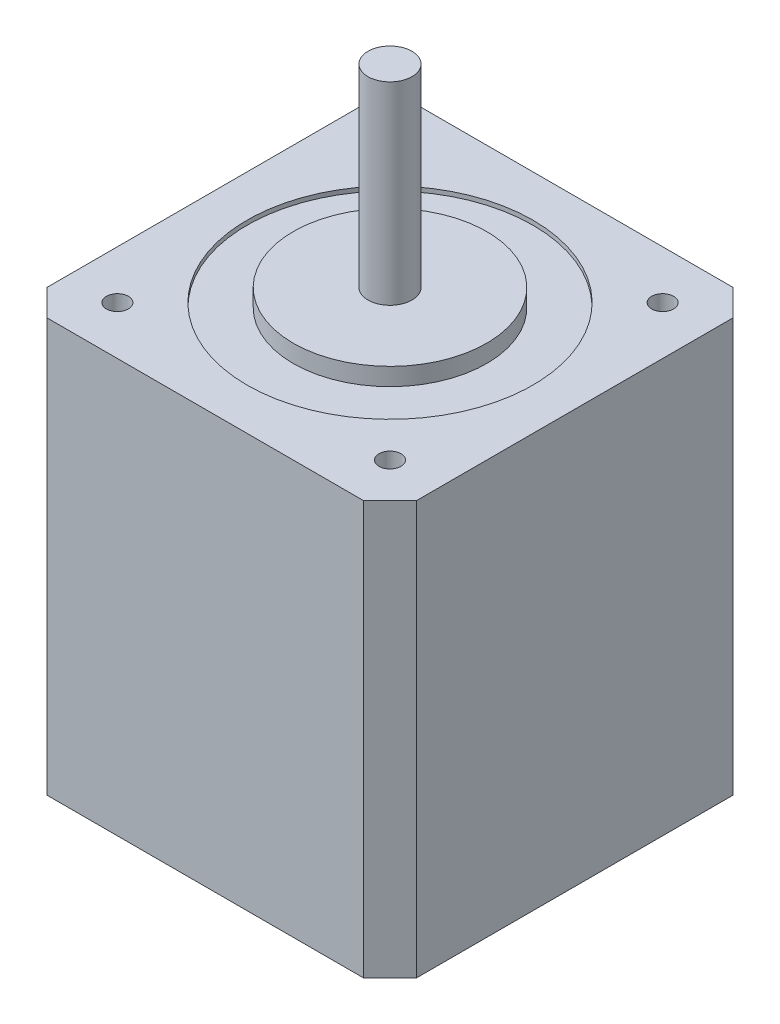
ISO-10303-21;
HEADER;
FILE_DESCRIPTION(('STEP AP214'),'2;1');
FILE_NAME('part.step','',(''),(''),'','','');
FILE_SCHEMA(('AUTOMOTIVE_DESIGN { 1 0 10303 214 1 1 1 1 }'));
ENDSEC;
DATA;
#1=APPLICATION_CONTEXT('core data for automotive mechanical design processes');
#2=APPLICATION_PROTOCOL_DEFINITION('international standard','automotive_design',2000,#1);
#3=PRODUCT_CONTEXT('',#1,'mechanical');
#4=PRODUCT('Part','Part','',(#3));
#5=PRODUCT_RELATED_PRODUCT_CATEGORY('part','',(#4));
#6=PRODUCT_DEFINITION_FORMATION('','',#4);
#7=PRODUCT_DEFINITION_CONTEXT('part definition',#1,'design');
#8=PRODUCT_DEFINITION('design','',#6,#7);
#9=PRODUCT_DEFINITION_SHAPE('','',#8);
#10=(LENGTH_UNIT() NAMED_UNIT(*) SI_UNIT(.MILLI.,.METRE.));
#11=(NAMED_UNIT(*) PLANE_ANGLE_UNIT() SI_UNIT($,.RADIAN.));
#12=(NAMED_UNIT(*) SI_UNIT($,.STERADIAN.) SOLID_ANGLE_UNIT());
#13=UNCERTAINTY_MEASURE_WITH_UNIT(LENGTH_MEASURE(1.E-05),#10,'distance_accuracy_value','');
#14=(GEOMETRIC_REPRESENTATION_CONTEXT(3) GLOBAL_UNCERTAINTY_ASSIGNED_CONTEXT((#13)) GLOBAL_UNIT_ASSIGNED_CONTEXT((#10,
#11,#12)) REPRESENTATION_CONTEXT('',''));
#15=CARTESIAN_POINT('',(0.,0.,0.));
#16=DIRECTION('',(0.,0.,1.));
#17=DIRECTION('',(1.,0.,0.));
#18=AXIS2_PLACEMENT_3D('',#15,#16,#17);
#19=CARTESIAN_POINT('',(21.,47.,21.));
#20=DIRECTION('',(-1.,0.,0.));
#21=DIRECTION('',(0.,0.,1.));
#22=AXIS2_PLACEMENT_3D('',#19,#20,#21);
#23=PLANE('',#22);
#24=DIRECTION('',(0.,0.,-1.));
#25=VECTOR('',#24,1.);
#26=CARTESIAN_POINT('',(21.,47.,21.));
#27=LINE('',#26,#25);
#28=CARTESIAN_POINT('',(21.,47.,18.));
#29=VERTEX_POINT('',#28);
#30=CARTESIAN_POINT('',(21.,47.,-18.));
#31=VERTEX_POINT('',#30);
#32=EDGE_CURVE('E161',#29,#31,#27,.T.);
#33=ORIENTED_EDGE('',*,*,#32,.F.);
#34=DIRECTION('',(0.,-1.,0.));
#35=VECTOR('',#34,1.);
#36=CARTESIAN_POINT('',(21.,47.,18.));
#37=LINE('',#36,#35);
#38=CARTESIAN_POINT('',(21.,0.,18.));
#39=VERTEX_POINT('',#38);
#40=EDGE_CURVE('E208',#29,#39,#37,.T.);
#41=ORIENTED_EDGE('',*,*,#40,.T.);
#42=DIRECTION('',(0.,0.,-1.));
#43=VECTOR('',#42,1.);
#44=CARTESIAN_POINT('',(21.,0.,21.));
#45=LINE('',#44,#43);
#46=CARTESIAN_POINT('',(21.,0.,-18.));
#47=VERTEX_POINT('',#46);
#48=EDGE_CURVE('E158',#39,#47,#45,.T.);
#49=ORIENTED_EDGE('',*,*,#48,.T.);
#50=DIRECTION('',(0.,1.,0.));
#51=VECTOR('',#50,1.);
#52=CARTESIAN_POINT('',(21.,47.,-18.));
#53=LINE('',#52,#51);
#54=EDGE_CURVE('E206',#47,#31,#53,.T.);
#55=ORIENTED_EDGE('',*,*,#54,.T.);
#56=EDGE_LOOP('',(#33,#41,#49,#55));
#57=FACE_BOUND('',#56,.T.);
#58=ADVANCED_FACE('F34',(#57),#23,.F.);
#59=CARTESIAN_POINT('',(-21.,47.,-21.));
#60=DIRECTION('',(0.,0.,1.));
#61=DIRECTION('',(1.,0.,0.));
#62=AXIS2_PLACEMENT_3D('',#59,#60,#61);
#63=PLANE('',#62);
#64=DIRECTION('',(-1.,0.,0.));
#65=VECTOR('',#64,1.);
#66=CARTESIAN_POINT('',(-21.,0.,-21.));
#67=LINE('',#66,#65);
#68=CARTESIAN_POINT('',(18.,0.,-21.));
#69=VERTEX_POINT('',#68);
#70=CARTESIAN_POINT('',(-18.,0.,-21.));
#71=VERTEX_POINT('',#70);
#72=EDGE_CURVE('E175',#69,#71,#67,.T.);
#73=ORIENTED_EDGE('',*,*,#72,.T.);
#74=DIRECTION('',(0.,1.,0.));
#75=VECTOR('',#74,1.);
#76=CARTESIAN_POINT('',(-18.,47.,-21.));
#77=LINE('',#76,#75);
#78=CARTESIAN_POINT('',(-18.,47.,-21.));
#79=VERTEX_POINT('',#78);
#80=EDGE_CURVE('E11',#71,#79,#77,.T.);
#81=ORIENTED_EDGE('',*,*,#80,.T.);
#82=DIRECTION('',(-1.,0.,0.));
#83=VECTOR('',#82,1.);
#84=CARTESIAN_POINT('',(-21.,47.,-21.));
#85=LINE('',#84,#83);
#86=CARTESIAN_POINT('',(18.,47.,-21.));
#87=VERTEX_POINT('',#86);
#88=EDGE_CURVE('E163',#87,#79,#85,.T.);
#89=ORIENTED_EDGE('',*,*,#88,.F.);
#90=DIRECTION('',(0.,-1.,0.));
#91=VECTOR('',#90,1.);
#92=CARTESIAN_POINT('',(18.,47.,-21.));
#93=LINE('',#92,#91);
#94=EDGE_CURVE('E42',#87,#69,#93,.T.);
#95=ORIENTED_EDGE('',*,*,#94,.T.);
#96=EDGE_LOOP('',(#73,#81,#89,#95));
#97=FACE_BOUND('',#96,.T.);
#98=ADVANCED_FACE('F213',(#97),#63,.F.);
#99=CARTESIAN_POINT('',(-21.,47.,21.));
#100=DIRECTION('',(1.,0.,0.));
#101=DIRECTION('',(0.,0.,-1.));
#102=AXIS2_PLACEMENT_3D('',#99,#100,#101);
#103=PLANE('',#102);
#104=DIRECTION('',(0.,0.,1.));
#105=VECTOR('',#104,1.);
#106=CARTESIAN_POINT('',(-21.,0.,21.));
#107=LINE('',#106,#105);
#108=CARTESIAN_POINT('',(-21.,0.,-18.));
#109=VERTEX_POINT('',#108);
#110=CARTESIAN_POINT('',(-21.,0.,18.));
#111=VERTEX_POINT('',#110);
#112=EDGE_CURVE('E177',#109,#111,#107,.T.);
#113=ORIENTED_EDGE('',*,*,#112,.T.);
#114=DIRECTION('',(0.,1.,0.));
#115=VECTOR('',#114,1.);
#116=CARTESIAN_POINT('',(-21.,47.,18.));
#117=LINE('',#116,#115);
#118=CARTESIAN_POINT('',(-21.,47.,18.));
#119=VERTEX_POINT('',#118);
#120=EDGE_CURVE('E197',#111,#119,#117,.T.);
#121=ORIENTED_EDGE('',*,*,#120,.T.);
#122=DIRECTION('',(0.,0.,1.));
#123=VECTOR('',#122,1.);
#124=CARTESIAN_POINT('',(-21.,47.,21.));
#125=LINE('',#124,#123);
#126=CARTESIAN_POINT('',(-21.,47.,-18.));
#127=VERTEX_POINT('',#126);
#128=EDGE_CURVE('E166',#127,#119,#125,.T.);
#129=ORIENTED_EDGE('',*,*,#128,.F.);
#130=DIRECTION('',(0.,-1.,0.));
#131=VECTOR('',#130,1.);
#132=CARTESIAN_POINT('',(-21.,47.,-18.));
#133=LINE('',#132,#131);
#134=EDGE_CURVE('E194',#127,#109,#133,.T.);
#135=ORIENTED_EDGE('',*,*,#134,.T.);
#136=EDGE_LOOP('',(#113,#121,#129,#135));
#137=FACE_BOUND('',#136,.T.);
#138=ADVANCED_FACE('F226',(#137),#103,.F.);
#139=CARTESIAN_POINT('',(-21.,47.,21.));
#140=DIRECTION('',(0.,0.,-1.));
#141=DIRECTION('',(-1.,0.,0.));
#142=AXIS2_PLACEMENT_3D('',#139,#140,#141);
#143=PLANE('',#142);
#144=DIRECTION('',(1.,0.,0.));
#145=VECTOR('',#144,1.);
#146=CARTESIAN_POINT('',(-21.,47.,21.));
#147=LINE('',#146,#145);
#148=CARTESIAN_POINT('',(-18.,47.,21.));
#149=VERTEX_POINT('',#148);
#150=CARTESIAN_POINT('',(18.,47.,21.));
#151=VERTEX_POINT('',#150);
#152=EDGE_CURVE('E169',#149,#151,#147,.T.);
#153=ORIENTED_EDGE('',*,*,#152,.F.);
#154=DIRECTION('',(0.,-1.,0.));
#155=VECTOR('',#154,1.);
#156=CARTESIAN_POINT('',(-18.,47.,21.));
#157=LINE('',#156,#155);
#158=CARTESIAN_POINT('',(-18.,0.,21.));
#159=VERTEX_POINT('',#158);
#160=EDGE_CURVE('E183',#149,#159,#157,.T.);
#161=ORIENTED_EDGE('',*,*,#160,.T.);
#162=DIRECTION('',(1.,0.,0.));
#163=VECTOR('',#162,1.);
#164=CARTESIAN_POINT('',(-21.,0.,21.));
#165=LINE('',#164,#163);
#166=CARTESIAN_POINT('',(18.,0.,21.));
#167=VERTEX_POINT('',#166);
#168=EDGE_CURVE('E164',#159,#167,#165,.T.);
#169=ORIENTED_EDGE('',*,*,#168,.T.);
#170=DIRECTION('',(0.,1.,0.));
#171=VECTOR('',#170,1.);
#172=CARTESIAN_POINT('',(18.,47.,21.));
#173=LINE('',#172,#171);
#174=EDGE_CURVE('E172',#167,#151,#173,.T.);
#175=ORIENTED_EDGE('',*,*,#174,.T.);
#176=EDGE_LOOP('',(#153,#161,#169,#175));
#177=FACE_BOUND('',#176,.T.);
#178=ADVANCED_FACE('F235',(#177),#143,.F.);
#179=CARTESIAN_POINT('',(0.,47.,0.));
#180=DIRECTION('',(0.,-1.,0.));
#181=DIRECTION('',(0.,0.,-1.));
#182=AXIS2_PLACEMENT_3D('',#179,#180,#181);
#183=PLANE('',#182);
#184=CARTESIAN_POINT('',(-15.5,47.,-15.5));
#185=DIRECTION('',(0.,1.,0.));
#186=DIRECTION('',(0.,0.,1.));
#187=AXIS2_PLACEMENT_3D('',#184,#185,#186);
#188=CIRCLE('',#187,1.24999999999999);
#189=CARTESIAN_POINT('',(-15.5,47.,-14.25));
#190=VERTEX_POINT('',#189);
#191=EDGE_CURVE('E120',#190,#190,#188,.T.);
#192=ORIENTED_EDGE('',*,*,#191,.F.);
#193=EDGE_LOOP('',(#192));
#194=FACE_BOUND('',#193,.T.);
#195=CARTESIAN_POINT('',(-15.5,47.,15.5));
#196=DIRECTION('',(0.,1.,0.));
#197=DIRECTION('',(0.,0.,1.));
#198=AXIS2_PLACEMENT_3D('',#195,#196,#197);
#199=CIRCLE('',#198,1.24999999999999);
#200=CARTESIAN_POINT('',(-15.5,47.,16.75));
#201=VERTEX_POINT('',#200);
#202=EDGE_CURVE('E119',#201,#201,#199,.T.);
#203=ORIENTED_EDGE('',*,*,#202,.F.);
#204=EDGE_LOOP('',(#203));
#205=FACE_BOUND('',#204,.T.);
#206=CARTESIAN_POINT('',(15.5,47.,-15.5));
#207=DIRECTION('',(0.,1.,0.));
#208=DIRECTION('',(0.,0.,1.));
#209=AXIS2_PLACEMENT_3D('',#206,#207,#208);
#210=CIRCLE('',#209,1.24999999999999);
#211=CARTESIAN_POINT('',(15.5,47.,-14.25));
#212=VERTEX_POINT('',#211);
#213=EDGE_CURVE('E130',#212,#212,#210,.T.);
#214=ORIENTED_EDGE('',*,*,#213,.F.);
#215=EDGE_LOOP('',(#214));
#216=FACE_BOUND('',#215,.T.);
#217=CARTESIAN_POINT('',(15.5,47.,15.5));
#218=DIRECTION('',(0.,1.,0.));
#219=DIRECTION('',(0.,0.,1.));
#220=AXIS2_PLACEMENT_3D('',#217,#218,#219);
#221=CIRCLE('',#220,1.24999999999999);
#222=CARTESIAN_POINT('',(15.5,47.,16.75));
#223=VERTEX_POINT('',#222);
#224=EDGE_CURVE('E136',#223,#223,#221,.T.);
#225=ORIENTED_EDGE('',*,*,#224,.F.);
#226=EDGE_LOOP('',(#225));
#227=FACE_BOUND('',#226,.T.);
#228=CARTESIAN_POINT('',(0.,47.,0.));
#229=DIRECTION('',(0.,1.,0.));
#230=DIRECTION('',(0.,0.,1.));
#231=AXIS2_PLACEMENT_3D('',#228,#229,#230);
#232=CIRCLE('',#231,16.25);
#233=CARTESIAN_POINT('',(0.,47.,16.25));
#234=VERTEX_POINT('',#233);
#235=EDGE_CURVE('E152',#234,#234,#232,.T.);
#236=ORIENTED_EDGE('',*,*,#235,.F.);
#237=EDGE_LOOP('',(#236));
#238=FACE_BOUND('',#237,.T.);
#239=ORIENTED_EDGE('',*,*,#128,.T.);
#240=DIRECTION('',(-0.707106781186546,0.,-0.707106781186549));
#241=VECTOR('',#240,1.);
#242=CARTESIAN_POINT('',(-18.,47.,21.));
#243=LINE('',#242,#241);
#244=EDGE_CURVE('E204',#119,#149,#243,.F.);
#245=ORIENTED_EDGE('',*,*,#244,.T.);
#246=ORIENTED_EDGE('',*,*,#152,.T.);
#247=DIRECTION('',(-0.707106781186549,0.,0.707106781186546));
#248=VECTOR('',#247,1.);
#249=CARTESIAN_POINT('',(21.,47.,18.));
#250=LINE('',#249,#248);
#251=EDGE_CURVE('E202',#151,#29,#250,.F.);
#252=ORIENTED_EDGE('',*,*,#251,.T.);
#253=ORIENTED_EDGE('',*,*,#32,.T.);
#254=DIRECTION('',(0.707106781186546,0.,0.707106781186549));
#255=VECTOR('',#254,1.);
#256=CARTESIAN_POINT('',(18.,47.,-21.));
#257=LINE('',#256,#255);
#258=EDGE_CURVE('E54',#31,#87,#257,.F.);
#259=ORIENTED_EDGE('',*,*,#258,.T.);
#260=ORIENTED_EDGE('',*,*,#88,.T.);
#261=DIRECTION('',(0.707106781186549,0.,-0.707106781186546));
#262=VECTOR('',#261,1.);
#263=CARTESIAN_POINT('',(-21.,47.,-18.));
#264=LINE('',#263,#262);
#265=EDGE_CURVE('E200',#79,#127,#264,.F.);
#266=ORIENTED_EDGE('',*,*,#265,.T.);
#267=EDGE_LOOP('',(#239,#245,#246,#252,#253,#259,#260,#266));
#268=FACE_BOUND('',#267,.T.);
#269=ADVANCED_FACE('F229',(#194,#205,#216,#227,#238,#268),#183,.F.);
#270=CARTESIAN_POINT('',(0.,0.,0.));
#271=DIRECTION('',(0.,-1.,0.));
#272=DIRECTION('',(0.,0.,-1.));
#273=AXIS2_PLACEMENT_3D('',#270,#271,#272);
#274=PLANE('',#273);
#275=ORIENTED_EDGE('',*,*,#168,.F.);
#276=DIRECTION('',(0.707106781186546,0.,0.707106781186549));
#277=VECTOR('',#276,1.);
#278=CARTESIAN_POINT('',(-19.5,0.,19.4999999999999));
#279=LINE('',#278,#277);
#280=EDGE_CURVE('E192',#159,#111,#279,.F.);
#281=ORIENTED_EDGE('',*,*,#280,.T.);
#282=ORIENTED_EDGE('',*,*,#112,.F.);
#283=DIRECTION('',(-0.707106781186549,0.,0.707106781186546));
#284=VECTOR('',#283,1.);
#285=CARTESIAN_POINT('',(-19.4999999999999,0.,-19.5));
#286=LINE('',#285,#284);
#287=EDGE_CURVE('E188',#109,#71,#286,.F.);
#288=ORIENTED_EDGE('',*,*,#287,.T.);
#289=ORIENTED_EDGE('',*,*,#72,.F.);
#290=DIRECTION('',(-0.707106781186546,0.,-0.707106781186549));
#291=VECTOR('',#290,1.);
#292=CARTESIAN_POINT('',(19.5,0.,-19.4999999999999));
#293=LINE('',#292,#291);
#294=EDGE_CURVE('E186',#69,#47,#293,.F.);
#295=ORIENTED_EDGE('',*,*,#294,.T.);
#296=ORIENTED_EDGE('',*,*,#48,.F.);
#297=DIRECTION('',(0.707106781186549,0.,-0.707106781186546));
#298=VECTOR('',#297,1.);
#299=CARTESIAN_POINT('',(19.4999999999999,0.,19.5));
#300=LINE('',#299,#298);
#301=EDGE_CURVE('E190',#39,#167,#300,.F.);
#302=ORIENTED_EDGE('',*,*,#301,.T.);
#303=EDGE_LOOP('',(#275,#281,#282,#288,#289,#295,#296,#302));
#304=FACE_BOUND('',#303,.T.);
#305=ADVANCED_FACE('F217',(#304),#274,.T.);
#306=CARTESIAN_POINT('',(0.,46.5,0.));
#307=DIRECTION('',(0.,1.,0.));
#308=DIRECTION('',(0.,0.,1.));
#309=AXIS2_PLACEMENT_3D('',#306,#307,#308);
#310=CYLINDRICAL_SURFACE('',#309,16.25);
#311=CARTESIAN_POINT('',(0.,46.5,0.));
#312=DIRECTION('',(0.,1.,0.));
#313=DIRECTION('',(0.,0.,1.));
#314=AXIS2_PLACEMENT_3D('',#311,#312,#313);
#315=CIRCLE('',#314,16.25);
#316=CARTESIAN_POINT('',(0.,46.5,16.25));
#317=VERTEX_POINT('',#316);
#318=EDGE_CURVE('E155',#317,#317,#315,.T.);
#319=ORIENTED_EDGE('',*,*,#318,.F.);
#320=EDGE_LOOP('',(#319));
#321=FACE_BOUND('',#320,.T.);
#322=ORIENTED_EDGE('',*,*,#235,.T.);
#323=EDGE_LOOP('',(#322));
#324=FACE_BOUND('',#323,.T.);
#325=ADVANCED_FACE('F375',(#321,#324),#310,.F.);
#326=CARTESIAN_POINT('',(0.,46.5,0.));
#327=DIRECTION('',(0.,1.,0.));
#328=DIRECTION('',(0.,0.,1.));
#329=AXIS2_PLACEMENT_3D('',#326,#327,#328);
#330=PLANE('',#329);
#331=CARTESIAN_POINT('',(0.,46.5,0.));
#332=DIRECTION('',(0.,1.,0.));
#333=DIRECTION('',(0.,0.,1.));
#334=AXIS2_PLACEMENT_3D('',#331,#332,#333);
#335=CIRCLE('',#334,11.);
#336=CARTESIAN_POINT('',(0.,46.5,11.));
#337=VERTEX_POINT('',#336);
#338=EDGE_CURVE('E146',#337,#337,#335,.T.);
#339=ORIENTED_EDGE('',*,*,#338,.F.);
#340=EDGE_LOOP('',(#339));
#341=FACE_BOUND('',#340,.T.);
#342=ORIENTED_EDGE('',*,*,#318,.T.);
#343=EDGE_LOOP('',(#342));
#344=FACE_BOUND('',#343,.T.);
#345=ADVANCED_FACE('F369',(#341,#344),#330,.T.);
#346=CARTESIAN_POINT('',(0.,48.5,0.));
#347=DIRECTION('',(0.,-1.,0.));
#348=DIRECTION('',(0.,0.,-1.));
#349=AXIS2_PLACEMENT_3D('',#346,#347,#348);
#350=CYLINDRICAL_SURFACE('',#349,11.);
#351=CARTESIAN_POINT('',(0.,48.5,0.));
#352=DIRECTION('',(0.,1.,0.));
#353=DIRECTION('',(0.,0.,1.));
#354=AXIS2_PLACEMENT_3D('',#351,#352,#353);
#355=CIRCLE('',#354,11.);
#356=CARTESIAN_POINT('',(0.,48.5,11.));
#357=VERTEX_POINT('',#356);
#358=EDGE_CURVE('E149',#357,#357,#355,.T.);
#359=ORIENTED_EDGE('',*,*,#358,.F.);
#360=EDGE_LOOP('',(#359));
#361=FACE_BOUND('',#360,.T.);
#362=ORIENTED_EDGE('',*,*,#338,.T.);
#363=EDGE_LOOP('',(#362));
#364=FACE_BOUND('',#363,.T.);
#365=ADVANCED_FACE('F374',(#361,#364),#350,.T.);
#366=CARTESIAN_POINT('',(0.,48.5,0.));
#367=DIRECTION('',(0.,1.,0.));
#368=DIRECTION('',(0.,0.,1.));
#369=AXIS2_PLACEMENT_3D('',#366,#367,#368);
#370=PLANE('',#369);
#371=CARTESIAN_POINT('',(0.,48.5,0.));
#372=DIRECTION('',(0.,1.,0.));
#373=DIRECTION('',(0.,0.,1.));
#374=AXIS2_PLACEMENT_3D('',#371,#372,#373);
#375=CIRCLE('',#374,2.5);
#376=CARTESIAN_POINT('',(0.,48.5,2.5));
#377=VERTEX_POINT('',#376);
#378=EDGE_CURVE('E142',#377,#377,#375,.T.);
#379=ORIENTED_EDGE('',*,*,#378,.F.);
#380=EDGE_LOOP('',(#379));
#381=FACE_BOUND('',#380,.T.);
#382=ORIENTED_EDGE('',*,*,#358,.T.);
#383=EDGE_LOOP('',(#382));
#384=FACE_BOUND('',#383,.T.);
#385=ADVANCED_FACE('F385',(#381,#384),#370,.T.);
#386=CARTESIAN_POINT('',(0.,70.5,0.));
#387=DIRECTION('',(0.,-1.,0.));
#388=DIRECTION('',(0.,0.,-1.));
#389=AXIS2_PLACEMENT_3D('',#386,#387,#388);
#390=CYLINDRICAL_SURFACE('',#389,2.5);
#391=CARTESIAN_POINT('',(0.,70.5,0.));
#392=DIRECTION('',(0.,1.,0.));
#393=DIRECTION('',(0.,0.,1.));
#394=AXIS2_PLACEMENT_3D('',#391,#392,#393);
#395=CIRCLE('',#394,2.5);
#396=CARTESIAN_POINT('',(0.,70.5,2.5));
#397=VERTEX_POINT('',#396);
#398=EDGE_CURVE('E143',#397,#397,#395,.T.);
#399=ORIENTED_EDGE('',*,*,#398,.F.);
#400=EDGE_LOOP('',(#399));
#401=FACE_BOUND('',#400,.T.);
#402=ORIENTED_EDGE('',*,*,#378,.T.);
#403=EDGE_LOOP('',(#402));
#404=FACE_BOUND('',#403,.T.);
#405=ADVANCED_FACE('F389',(#401,#404),#390,.T.);
#406=CARTESIAN_POINT('',(0.,70.5,0.));
#407=DIRECTION('',(0.,1.,0.));
#408=DIRECTION('',(0.,0.,1.));
#409=AXIS2_PLACEMENT_3D('',#406,#407,#408);
#410=PLANE('',#409);
#411=ORIENTED_EDGE('',*,*,#398,.T.);
#412=EDGE_LOOP('',(#411));
#413=FACE_BOUND('',#412,.T.);
#414=ADVANCED_FACE('F263',(#413),#410,.T.);
#415=CARTESIAN_POINT('',(-18.,47.,21.));
#416=DIRECTION('',(0.707106781186549,0.,-0.707106781186546));
#417=DIRECTION('',(0.,-1.,0.));
#418=AXIS2_PLACEMENT_3D('',#415,#416,#417);
#419=PLANE('',#418);
#420=ORIENTED_EDGE('',*,*,#244,.F.);
#421=ORIENTED_EDGE('',*,*,#120,.F.);
#422=ORIENTED_EDGE('',*,*,#280,.F.);
#423=ORIENTED_EDGE('',*,*,#160,.F.);
#424=EDGE_LOOP('',(#420,#421,#422,#423));
#425=FACE_BOUND('',#424,.T.);
#426=ADVANCED_FACE('F233',(#425),#419,.F.);
#427=CARTESIAN_POINT('',(21.,47.,18.));
#428=DIRECTION('',(-0.707106781186546,0.,-0.707106781186549));
#429=DIRECTION('',(0.,-1.,0.));
#430=AXIS2_PLACEMENT_3D('',#427,#428,#429);
#431=PLANE('',#430);
#432=ORIENTED_EDGE('',*,*,#251,.F.);
#433=ORIENTED_EDGE('',*,*,#174,.F.);
#434=ORIENTED_EDGE('',*,*,#301,.F.);
#435=ORIENTED_EDGE('',*,*,#40,.F.);
#436=EDGE_LOOP('',(#432,#433,#434,#435));
#437=FACE_BOUND('',#436,.T.);
#438=ADVANCED_FACE('F240',(#437),#431,.F.);
#439=CARTESIAN_POINT('',(-21.,47.,-18.));
#440=DIRECTION('',(0.707106781186546,0.,0.707106781186549));
#441=DIRECTION('',(0.,-1.,0.));
#442=AXIS2_PLACEMENT_3D('',#439,#440,#441);
#443=PLANE('',#442);
#444=ORIENTED_EDGE('',*,*,#265,.F.);
#445=ORIENTED_EDGE('',*,*,#80,.F.);
#446=ORIENTED_EDGE('',*,*,#287,.F.);
#447=ORIENTED_EDGE('',*,*,#134,.F.);
#448=EDGE_LOOP('',(#444,#445,#446,#447));
#449=FACE_BOUND('',#448,.T.);
#450=ADVANCED_FACE('F223',(#449),#443,.F.);
#451=CARTESIAN_POINT('',(18.,47.,-21.));
#452=DIRECTION('',(-0.707106781186549,0.,0.707106781186546));
#453=DIRECTION('',(0.,-1.,0.));
#454=AXIS2_PLACEMENT_3D('',#451,#452,#453);
#455=PLANE('',#454);
#456=ORIENTED_EDGE('',*,*,#258,.F.);
#457=ORIENTED_EDGE('',*,*,#54,.F.);
#458=ORIENTED_EDGE('',*,*,#294,.F.);
#459=ORIENTED_EDGE('',*,*,#94,.F.);
#460=EDGE_LOOP('',(#456,#457,#458,#459));
#461=FACE_BOUND('',#460,.T.);
#462=ADVANCED_FACE('F36',(#461),#455,.F.);
#463=CARTESIAN_POINT('',(15.5,39.5,15.5));
#464=DIRECTION('',(0.,1.,0.));
#465=DIRECTION('',(0.,0.,1.));
#466=AXIS2_PLACEMENT_3D('',#463,#464,#465);
#467=CONICAL_SURFACE('',#466,1.24999999999999,1.02974425867665);
#468=CARTESIAN_POINT('',(15.5,38.7489242262155,15.5));
#469=VERTEX_POINT('',#468);
#470=VERTEX_LOOP('',#469);
#471=FACE_BOUND('',#470,.T.);
#472=CARTESIAN_POINT('',(15.5,39.5,15.5));
#473=DIRECTION('',(0.,1.,0.));
#474=DIRECTION('',(0.,0.,1.));
#475=AXIS2_PLACEMENT_3D('',#472,#473,#474);
#476=CIRCLE('',#475,1.24999999999999);
#477=CARTESIAN_POINT('',(15.5,39.5,16.75));
#478=VERTEX_POINT('',#477);
#479=EDGE_CURVE('E139',#478,#478,#476,.T.);
#480=ORIENTED_EDGE('',*,*,#479,.T.);
#481=EDGE_LOOP('',(#480));
#482=FACE_BOUND('',#481,.T.);
#483=ADVANCED_FACE('F245',(#471,#482),#467,.F.);
#484=CARTESIAN_POINT('',(15.5,47.,15.5));
#485=DIRECTION('',(0.,1.,0.));
#486=DIRECTION('',(0.,0.,1.));
#487=AXIS2_PLACEMENT_3D('',#484,#485,#486);
#488=CYLINDRICAL_SURFACE('',#487,1.24999999999999);
#489=ORIENTED_EDGE('',*,*,#479,.F.);
#490=EDGE_LOOP('',(#489));
#491=FACE_BOUND('',#490,.T.);
#492=ORIENTED_EDGE('',*,*,#224,.T.);
#493=EDGE_LOOP('',(#492));
#494=FACE_BOUND('',#493,.T.);
#495=ADVANCED_FACE('F250',(#491,#494),#488,.F.);
#496=CARTESIAN_POINT('',(15.5,39.5,-15.5));
#497=DIRECTION('',(0.,1.,0.));
#498=DIRECTION('',(0.,0.,1.));
#499=AXIS2_PLACEMENT_3D('',#496,#497,#498);
#500=CONICAL_SURFACE('',#499,1.24999999999999,1.02974425867665);
#501=CARTESIAN_POINT('',(15.5,38.7489242262155,-15.5));
#502=VERTEX_POINT('',#501);
#503=VERTEX_LOOP('',#502);
#504=FACE_BOUND('',#503,.T.);
#505=CARTESIAN_POINT('',(15.5,39.5,-15.5));
#506=DIRECTION('',(0.,1.,0.));
#507=DIRECTION('',(0.,0.,1.));
#508=AXIS2_PLACEMENT_3D('',#505,#506,#507);
#509=CIRCLE('',#508,1.24999999999999);
#510=CARTESIAN_POINT('',(15.5,39.5,-14.25));
#511=VERTEX_POINT('',#510);
#512=EDGE_CURVE('E133',#511,#511,#509,.T.);
#513=ORIENTED_EDGE('',*,*,#512,.T.);
#514=EDGE_LOOP('',(#513));
#515=FACE_BOUND('',#514,.T.);
#516=ADVANCED_FACE('F307',(#504,#515),#500,.F.);
#517=CARTESIAN_POINT('',(15.5,47.,-15.5));
#518=DIRECTION('',(0.,1.,0.));
#519=DIRECTION('',(0.,0.,1.));
#520=AXIS2_PLACEMENT_3D('',#517,#518,#519);
#521=CYLINDRICAL_SURFACE('',#520,1.24999999999999);
#522=ORIENTED_EDGE('',*,*,#512,.F.);
#523=EDGE_LOOP('',(#522));
#524=FACE_BOUND('',#523,.T.);
#525=ORIENTED_EDGE('',*,*,#213,.T.);
#526=EDGE_LOOP('',(#525));
#527=FACE_BOUND('',#526,.T.);
#528=ADVANCED_FACE('F318',(#524,#527),#521,.F.);
#529=CARTESIAN_POINT('',(-15.5,39.5,15.5));
#530=DIRECTION('',(0.,1.,0.));
#531=DIRECTION('',(0.,0.,1.));
#532=AXIS2_PLACEMENT_3D('',#529,#530,#531);
#533=CONICAL_SURFACE('',#532,1.24999999999999,1.02974425867665);
#534=CARTESIAN_POINT('',(-15.5,38.7489242262155,15.5));
#535=VERTEX_POINT('',#534);
#536=VERTEX_LOOP('',#535);
#537=FACE_BOUND('',#536,.T.);
#538=CARTESIAN_POINT('',(-15.5,39.5,15.5));
#539=DIRECTION('',(0.,1.,0.));
#540=DIRECTION('',(0.,0.,1.));
#541=AXIS2_PLACEMENT_3D('',#538,#539,#540);
#542=CIRCLE('',#541,1.24999999999999);
#543=CARTESIAN_POINT('',(-15.5,39.5,16.75));
#544=VERTEX_POINT('',#543);
#545=EDGE_CURVE('E123',#544,#544,#542,.T.);
#546=ORIENTED_EDGE('',*,*,#545,.T.);
#547=EDGE_LOOP('',(#546));
#548=FACE_BOUND('',#547,.T.);
#549=ADVANCED_FACE('F328',(#537,#548),#533,.F.);
#550=CARTESIAN_POINT('',(-15.5,47.,15.5));
#551=DIRECTION('',(0.,1.,0.));
#552=DIRECTION('',(0.,0.,1.));
#553=AXIS2_PLACEMENT_3D('',#550,#551,#552);
#554=CYLINDRICAL_SURFACE('',#553,1.24999999999999);
#555=ORIENTED_EDGE('',*,*,#545,.F.);
#556=EDGE_LOOP('',(#555));
#557=FACE_BOUND('',#556,.T.);
#558=ORIENTED_EDGE('',*,*,#202,.T.);
#559=EDGE_LOOP('',(#558));
#560=FACE_BOUND('',#559,.T.);
#561=ADVANCED_FACE('F113',(#557,#560),#554,.F.);
#562=CARTESIAN_POINT('',(-15.5,39.5,-15.5));
#563=DIRECTION('',(0.,1.,0.));
#564=DIRECTION('',(0.,0.,1.));
#565=AXIS2_PLACEMENT_3D('',#562,#563,#564);
#566=CONICAL_SURFACE('',#565,1.24999999999999,1.02974425867665);
#567=CARTESIAN_POINT('',(-15.5,38.7489242262155,-15.5));
#568=VERTEX_POINT('',#567);
#569=VERTEX_LOOP('',#568);
#570=FACE_BOUND('',#569,.T.);
#571=CARTESIAN_POINT('',(-15.5,39.5,-15.5));
#572=DIRECTION('',(0.,1.,0.));
#573=DIRECTION('',(0.,0.,1.));
#574=AXIS2_PLACEMENT_3D('',#571,#572,#573);
#575=CIRCLE('',#574,1.24999999999999);
#576=CARTESIAN_POINT('',(-15.5,39.5,-14.25));
#577=VERTEX_POINT('',#576);
#578=EDGE_CURVE('E117',#577,#577,#575,.T.);
#579=ORIENTED_EDGE('',*,*,#578,.T.);
#580=EDGE_LOOP('',(#579));
#581=FACE_BOUND('',#580,.T.);
#582=ADVANCED_FACE('F109',(#570,#581),#566,.F.);
#583=CARTESIAN_POINT('',(-15.5,47.,-15.5));
#584=DIRECTION('',(0.,1.,0.));
#585=DIRECTION('',(0.,0.,1.));
#586=AXIS2_PLACEMENT_3D('',#583,#584,#585);
#587=CYLINDRICAL_SURFACE('',#586,1.24999999999999);
#588=ORIENTED_EDGE('',*,*,#578,.F.);
#589=EDGE_LOOP('',(#588));
#590=FACE_BOUND('',#589,.T.);
#591=ORIENTED_EDGE('',*,*,#191,.T.);
#592=EDGE_LOOP('',(#591));
#593=FACE_BOUND('',#592,.T.);
#594=ADVANCED_FACE('F112',(#590,#593),#587,.F.);
#595=CLOSED_SHELL('',(#58,#98,#138,#178,#269,#305,#325,#345,#365,#385,#405,#414,#426,#438,#450,
#462,#483,#495,#516,#528,#549,#561,#582,#594));
#596=MANIFOLD_SOLID_BREP('B2',#595);
#597=ADVANCED_BREP_SHAPE_REPRESENTATION('',(#18,#596),#14);
#598=SHAPE_DEFINITION_REPRESENTATION(#9,#597);
ENDSEC;
END-ISO-10303-21;
